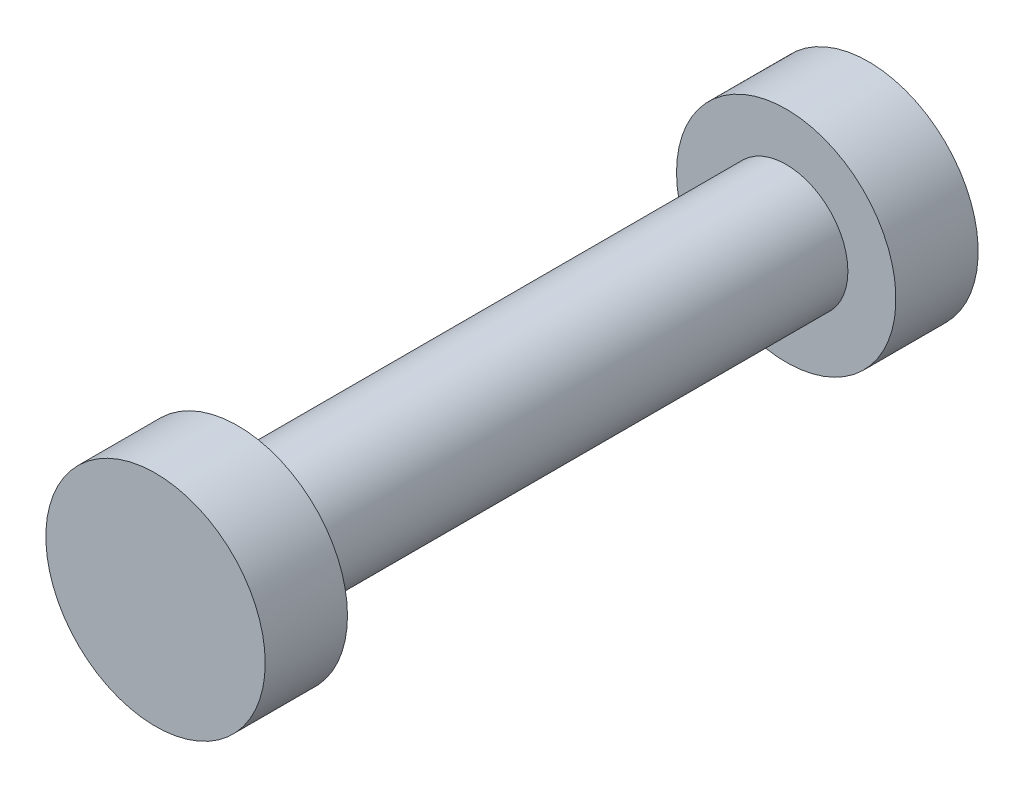
ISO-10303-21;
HEADER;
FILE_DESCRIPTION(('STEP AP214'),'2;1');
FILE_NAME('part.step','',(''),(''),'','','');
FILE_SCHEMA(('AUTOMOTIVE_DESIGN { 1 0 10303 214 1 1 1 1 }'));
ENDSEC;
DATA;
#1=APPLICATION_CONTEXT('core data for automotive mechanical design processes');
#2=APPLICATION_PROTOCOL_DEFINITION('international standard','automotive_design',2000,#1);
#3=PRODUCT_CONTEXT('',#1,'mechanical');
#4=PRODUCT('Part','Part','',(#3));
#5=PRODUCT_RELATED_PRODUCT_CATEGORY('part','',(#4));
#6=PRODUCT_DEFINITION_FORMATION('','',#4);
#7=PRODUCT_DEFINITION_CONTEXT('part definition',#1,'design');
#8=PRODUCT_DEFINITION('design','',#6,#7);
#9=PRODUCT_DEFINITION_SHAPE('','',#8);
#10=(LENGTH_UNIT() NAMED_UNIT(*) SI_UNIT(.MILLI.,.METRE.));
#11=(NAMED_UNIT(*) PLANE_ANGLE_UNIT() SI_UNIT($,.RADIAN.));
#12=(NAMED_UNIT(*) SI_UNIT($,.STERADIAN.) SOLID_ANGLE_UNIT());
#13=UNCERTAINTY_MEASURE_WITH_UNIT(LENGTH_MEASURE(1.E-05),#10,'distance_accuracy_value','');
#14=(GEOMETRIC_REPRESENTATION_CONTEXT(3) GLOBAL_UNCERTAINTY_ASSIGNED_CONTEXT((#13)) GLOBAL_UNIT_ASSIGNED_CONTEXT((#10,
#11,#12)) REPRESENTATION_CONTEXT('',''));
#15=CARTESIAN_POINT('',(0.,0.,0.));
#16=DIRECTION('',(0.,0.,1.));
#17=DIRECTION('',(1.,0.,0.));
#18=AXIS2_PLACEMENT_3D('',#15,#16,#17);
#19=CARTESIAN_POINT('',(0.,0.,20.));
#20=DIRECTION('',(0.,0.,-1.));
#21=DIRECTION('',(-1.,0.,0.));
#22=AXIS2_PLACEMENT_3D('',#19,#20,#21);
#23=CYLINDRICAL_SURFACE('',#22,2.25);
#24=CARTESIAN_POINT('',(0.,0.,20.));
#25=DIRECTION('',(0.,0.,1.));
#26=DIRECTION('',(1.,0.,0.));
#27=AXIS2_PLACEMENT_3D('',#24,#25,#26);
#28=CIRCLE('',#27,2.25);
#29=CARTESIAN_POINT('',(2.25,0.,20.));
#30=VERTEX_POINT('',#29);
#31=EDGE_CURVE('E10',#30,#30,#28,.T.);
#32=ORIENTED_EDGE('',*,*,#31,.F.);
#33=EDGE_LOOP('',(#32));
#34=FACE_BOUND('',#33,.T.);
#35=CARTESIAN_POINT('',(0.,0.,0.));
#36=DIRECTION('',(0.,0.,1.));
#37=DIRECTION('',(1.,0.,0.));
#38=AXIS2_PLACEMENT_3D('',#35,#36,#37);
#39=CIRCLE('',#38,2.25);
#40=CARTESIAN_POINT('',(2.25,0.,0.));
#41=VERTEX_POINT('',#40);
#42=EDGE_CURVE('E46',#41,#41,#39,.T.);
#43=ORIENTED_EDGE('',*,*,#42,.T.);
#44=EDGE_LOOP('',(#43));
#45=FACE_BOUND('',#44,.T.);
#46=ADVANCED_FACE('F43',(#34,#45),#23,.T.);
#47=CARTESIAN_POINT('',(0.,0.,23.));
#48=DIRECTION('',(0.,0.,-1.));
#49=DIRECTION('',(-1.,0.,0.));
#50=AXIS2_PLACEMENT_3D('',#47,#48,#49);
#51=CYLINDRICAL_SURFACE('',#50,4.);
#52=CARTESIAN_POINT('',(0.,0.,23.));
#53=DIRECTION('',(0.,0.,1.));
#54=DIRECTION('',(1.,0.,0.));
#55=AXIS2_PLACEMENT_3D('',#52,#53,#54);
#56=CIRCLE('',#55,4.);
#57=CARTESIAN_POINT('',(4.,0.,23.));
#58=VERTEX_POINT('',#57);
#59=EDGE_CURVE('E51',#58,#58,#56,.T.);
#60=ORIENTED_EDGE('',*,*,#59,.F.);
#61=EDGE_LOOP('',(#60));
#62=FACE_BOUND('',#61,.T.);
#63=CARTESIAN_POINT('',(0.,0.,20.));
#64=DIRECTION('',(0.,0.,1.));
#65=DIRECTION('',(1.,0.,0.));
#66=AXIS2_PLACEMENT_3D('',#63,#64,#65);
#67=CIRCLE('',#66,4.);
#68=CARTESIAN_POINT('',(4.,0.,20.));
#69=VERTEX_POINT('',#68);
#70=EDGE_CURVE('E57',#69,#69,#67,.T.);
#71=ORIENTED_EDGE('',*,*,#70,.T.);
#72=EDGE_LOOP('',(#71));
#73=FACE_BOUND('',#72,.T.);
#74=ADVANCED_FACE('F100',(#62,#73),#51,.T.);
#75=CARTESIAN_POINT('',(0.,0.,23.));
#76=DIRECTION('',(0.,0.,1.));
#77=DIRECTION('',(1.,0.,0.));
#78=AXIS2_PLACEMENT_3D('',#75,#76,#77);
#79=PLANE('',#78);
#80=ORIENTED_EDGE('',*,*,#59,.T.);
#81=EDGE_LOOP('',(#80));
#82=FACE_BOUND('',#81,.T.);
#83=ADVANCED_FACE('F91',(#82),#79,.T.);
#84=CARTESIAN_POINT('',(0.,0.,20.));
#85=DIRECTION('',(0.,0.,1.));
#86=DIRECTION('',(1.,0.,0.));
#87=AXIS2_PLACEMENT_3D('',#84,#85,#86);
#88=PLANE('',#87);
#89=ORIENTED_EDGE('',*,*,#31,.T.);
#90=EDGE_LOOP('',(#89));
#91=FACE_BOUND('',#90,.T.);
#92=ORIENTED_EDGE('',*,*,#70,.F.);
#93=EDGE_LOOP('',(#92));
#94=FACE_BOUND('',#93,.T.);
#95=ADVANCED_FACE('F81',(#91,#94),#88,.F.);
#96=CARTESIAN_POINT('',(0.,0.,-3.));
#97=DIRECTION('',(0.,0.,1.));
#98=DIRECTION('',(1.,0.,0.));
#99=AXIS2_PLACEMENT_3D('',#96,#97,#98);
#100=CYLINDRICAL_SURFACE('',#99,4.);
#101=CARTESIAN_POINT('',(0.,0.,-3.));
#102=DIRECTION('',(0.,0.,-1.));
#103=DIRECTION('',(-1.,0.,0.));
#104=AXIS2_PLACEMENT_3D('',#101,#102,#103);
#105=CIRCLE('',#104,4.);
#106=CARTESIAN_POINT('',(-4.,0.,-3.));
#107=VERTEX_POINT('',#106);
#108=EDGE_CURVE('E67',#107,#107,#105,.T.);
#109=ORIENTED_EDGE('',*,*,#108,.F.);
#110=EDGE_LOOP('',(#109));
#111=FACE_BOUND('',#110,.T.);
#112=CARTESIAN_POINT('',(0.,0.,0.));
#113=DIRECTION('',(0.,0.,-1.));
#114=DIRECTION('',(-1.,0.,0.));
#115=AXIS2_PLACEMENT_3D('',#112,#113,#114);
#116=CIRCLE('',#115,4.);
#117=CARTESIAN_POINT('',(-4.,0.,0.));
#118=VERTEX_POINT('',#117);
#119=EDGE_CURVE('E65',#118,#118,#116,.T.);
#120=ORIENTED_EDGE('',*,*,#119,.T.);
#121=EDGE_LOOP('',(#120));
#122=FACE_BOUND('',#121,.T.);
#123=ADVANCED_FACE('F83',(#111,#122),#100,.T.);
#124=CARTESIAN_POINT('',(0.,0.,-3.));
#125=DIRECTION('',(0.,0.,-1.));
#126=DIRECTION('',(-1.,0.,0.));
#127=AXIS2_PLACEMENT_3D('',#124,#125,#126);
#128=PLANE('',#127);
#129=ORIENTED_EDGE('',*,*,#108,.T.);
#130=EDGE_LOOP('',(#129));
#131=FACE_BOUND('',#130,.T.);
#132=ADVANCED_FACE('F76',(#131),#128,.T.);
#133=CARTESIAN_POINT('',(0.,0.,0.));
#134=DIRECTION('',(0.,0.,-1.));
#135=DIRECTION('',(-1.,0.,0.));
#136=AXIS2_PLACEMENT_3D('',#133,#134,#135);
#137=PLANE('',#136);
#138=ORIENTED_EDGE('',*,*,#42,.F.);
#139=EDGE_LOOP('',(#138));
#140=FACE_BOUND('',#139,.T.);
#141=ORIENTED_EDGE('',*,*,#119,.F.);
#142=EDGE_LOOP('',(#141));
#143=FACE_BOUND('',#142,.T.);
#144=ADVANCED_FACE('F77',(#140,#143),#137,.F.);
#145=CLOSED_SHELL('',(#46,#74,#83,#95,#123,#132,#144));
#146=MANIFOLD_SOLID_BREP('B2',#145);
#147=ADVANCED_BREP_SHAPE_REPRESENTATION('',(#18,#146),#14);
#148=SHAPE_DEFINITION_REPRESENTATION(#9,#147);
ENDSEC;
END-ISO-10303-21;
